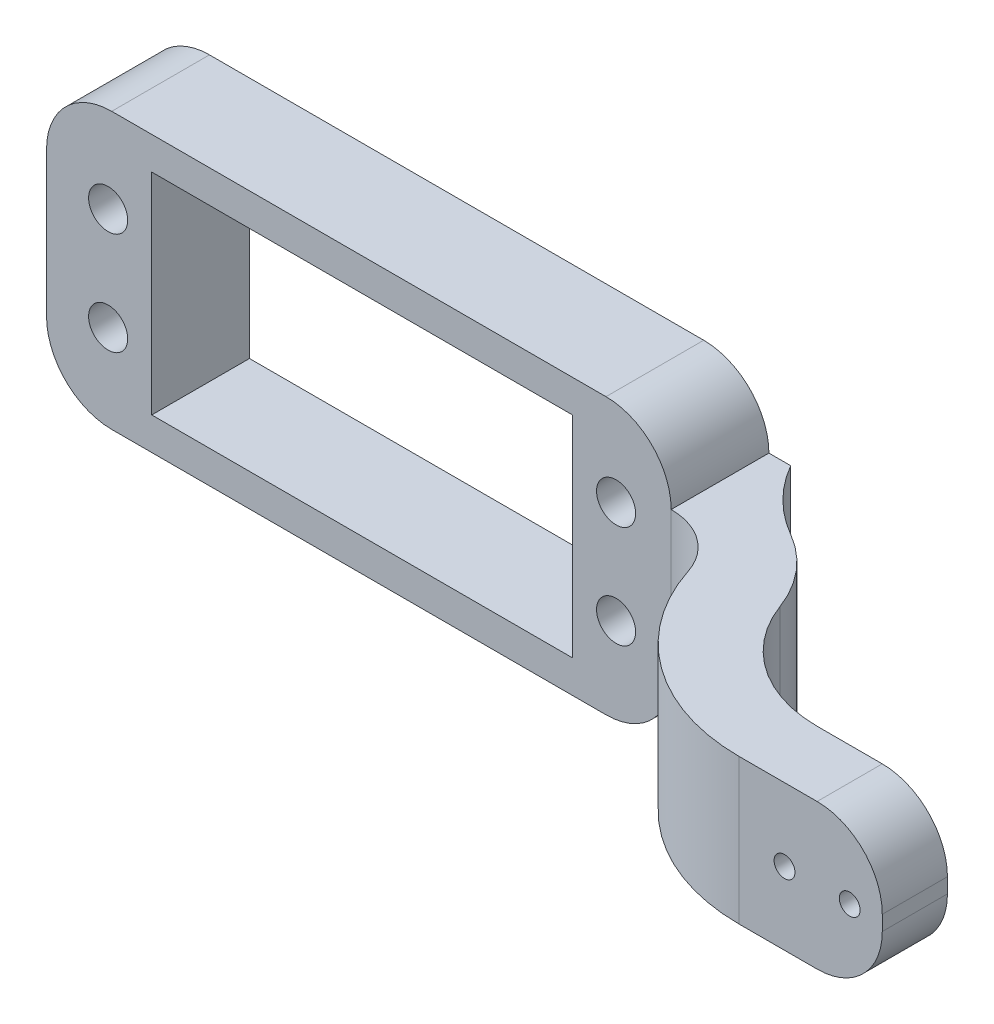
ISO-10303-21;
HEADER;
FILE_DESCRIPTION(('STEP AP214'),'2;1');
FILE_NAME('part.step','',(''),(''),'','','');
FILE_SCHEMA(('AUTOMOTIVE_DESIGN { 1 0 10303 214 1 1 1 1 }'));
ENDSEC;
DATA;
#1=APPLICATION_CONTEXT('core data for automotive mechanical design processes');
#2=APPLICATION_PROTOCOL_DEFINITION('international standard','automotive_design',2000,#1);
#3=PRODUCT_CONTEXT('',#1,'mechanical');
#4=PRODUCT('Part','Part','',(#3));
#5=PRODUCT_RELATED_PRODUCT_CATEGORY('part','',(#4));
#6=PRODUCT_DEFINITION_FORMATION('','',#4);
#7=PRODUCT_DEFINITION_CONTEXT('part definition',#1,'design');
#8=PRODUCT_DEFINITION('design','',#6,#7);
#9=PRODUCT_DEFINITION_SHAPE('','',#8);
#10=(LENGTH_UNIT() NAMED_UNIT(*) SI_UNIT(.MILLI.,.METRE.));
#11=(NAMED_UNIT(*) PLANE_ANGLE_UNIT() SI_UNIT($,.RADIAN.));
#12=(NAMED_UNIT(*) SI_UNIT($,.STERADIAN.) SOLID_ANGLE_UNIT());
#13=UNCERTAINTY_MEASURE_WITH_UNIT(LENGTH_MEASURE(1.E-05),#10,'distance_accuracy_value','');
#14=(GEOMETRIC_REPRESENTATION_CONTEXT(3) GLOBAL_UNCERTAINTY_ASSIGNED_CONTEXT((#13)) GLOBAL_UNIT_ASSIGNED_CONTEXT((#10,
#11,#12)) REPRESENTATION_CONTEXT('',''));
#15=CARTESIAN_POINT('',(0.,0.,0.));
#16=DIRECTION('',(0.,0.,1.));
#17=DIRECTION('',(1.,0.,0.));
#18=AXIS2_PLACEMENT_3D('',#15,#16,#17);
#19=CARTESIAN_POINT('',(0.,-7.07500000000002,13.589));
#20=DIRECTION('',(0.,-1.,0.));
#21=DIRECTION('',(0.,0.,-1.));
#22=AXIS2_PLACEMENT_3D('',#19,#20,#21);
#23=PLANE('',#22);
#24=DIRECTION('',(0.,0.,-1.));
#25=VECTOR('',#24,1.);
#26=CARTESIAN_POINT('',(30.1158833742651,-7.07500000000002,15.1765));
#27=LINE('',#26,#25);
#28=CARTESIAN_POINT('',(30.1158833742651,-7.07500000000003,15.1765));
#29=VERTEX_POINT('',#28);
#30=CARTESIAN_POINT('',(30.1158833742651,-7.07500000000002,5.6515));
#31=VERTEX_POINT('',#30);
#32=EDGE_CURVE('E292',#29,#31,#27,.T.);
#33=ORIENTED_EDGE('',*,*,#32,.T.);
#34=DIRECTION('',(1.,0.,0.));
#35=VECTOR('',#34,1.);
#36=CARTESIAN_POINT('',(0.,-7.07500000000002,5.6515));
#37=LINE('',#36,#35);
#38=CARTESIAN_POINT('',(32.2427300891871,-7.07500000000002,5.6515));
#39=VERTEX_POINT('',#38);
#40=EDGE_CURVE('E94',#31,#39,#37,.T.);
#41=ORIENTED_EDGE('',*,*,#40,.T.);
#42=CARTESIAN_POINT('',(45.9908833742651,-7.07500000000002,-2.286));
#43=DIRECTION('',(0.,-1.,0.));
#44=DIRECTION('',(0.,0.,-1.));
#45=AXIS2_PLACEMENT_3D('',#42,#43,#44);
#46=CIRCLE('',#45,15.875);
#47=CARTESIAN_POINT('',(38.0453631807094,-7.07500000000003,11.4575197039841));
#48=VERTEX_POINT('',#47);
#49=EDGE_CURVE('E342',#39,#48,#46,.F.);
#50=ORIENTED_EDGE('',*,*,#49,.T.);
#51=CARTESIAN_POINT('',(31.6889470258649,-7.07500000000002,22.4523354671714));
#52=DIRECTION('',(0.,-1.,0.));
#53=DIRECTION('',(0.,0.,-1.));
#54=AXIS2_PLACEMENT_3D('',#51,#52,#53);
#55=CIRCLE('',#54,12.7);
#56=CARTESIAN_POINT('',(43.602415200065,-7.07500000000003,18.0524177335857));
#57=VERTEX_POINT('',#56);
#58=EDGE_CURVE('E381',#57,#48,#55,.F.);
#59=ORIENTED_EDGE('',*,*,#58,.F.);
#60=CARTESIAN_POINT('',(55.5158833742651,-7.07500000000002,13.6525));
#61=DIRECTION('',(0.,-1.,0.));
#62=DIRECTION('',(0.,0.,-1.));
#63=AXIS2_PLACEMENT_3D('',#60,#61,#62);
#64=CIRCLE('',#63,12.7);
#65=CARTESIAN_POINT('',(55.5158833742651,-7.07500000000003,26.3525));
#66=VERTEX_POINT('',#65);
#67=EDGE_CURVE('E453',#66,#57,#64,.T.);
#68=ORIENTED_EDGE('',*,*,#67,.F.);
#69=DIRECTION('',(-1.,0.,0.));
#70=VECTOR('',#69,1.);
#71=CARTESIAN_POINT('',(0.,-7.07500000000002,26.3525));
#72=LINE('',#71,#70);
#73=CARTESIAN_POINT('',(61.8658833742651,-7.07500000000002,26.3525));
#74=VERTEX_POINT('',#73);
#75=EDGE_CURVE('E432',#74,#66,#72,.T.);
#76=ORIENTED_EDGE('',*,*,#75,.F.);
#77=DIRECTION('',(0.,0.,1.));
#78=VECTOR('',#77,1.);
#79=CARTESIAN_POINT('',(61.8658833742651,-7.07500000000002,32.7025));
#80=LINE('',#79,#78);
#81=CARTESIAN_POINT('',(61.8658833742651,-7.07500000000002,32.7025));
#82=VERTEX_POINT('',#81);
#83=EDGE_CURVE('E345',#74,#82,#80,.T.);
#84=ORIENTED_EDGE('',*,*,#83,.T.);
#85=DIRECTION('',(1.,0.,0.));
#86=VECTOR('',#85,1.);
#87=CARTESIAN_POINT('',(0.,-7.07500000000002,32.7025));
#88=LINE('',#87,#86);
#89=CARTESIAN_POINT('',(54.264591911162,-7.07500000000003,32.7025));
#90=VERTEX_POINT('',#89);
#91=EDGE_CURVE('E335',#90,#82,#88,.T.);
#92=ORIENTED_EDGE('',*,*,#91,.F.);
#93=CARTESIAN_POINT('',(54.264591911162,-7.07500000000002,13.6525));
#94=DIRECTION('',(0.,-1.,0.));
#95=DIRECTION('',(0.,0.,-1.));
#96=AXIS2_PLACEMENT_3D('',#93,#94,#95);
#97=CIRCLE('',#96,19.05);
#98=CARTESIAN_POINT('',(36.1530605084893,-7.07500000000003,19.558));
#99=VERTEX_POINT('',#98);
#100=EDGE_CURVE('E449',#90,#99,#97,.T.);
#101=ORIENTED_EDGE('',*,*,#100,.T.);
#102=CARTESIAN_POINT('',(30.1158833742651,-7.07500000000002,21.5265));
#103=DIRECTION('',(0.,-1.,0.));
#104=DIRECTION('',(0.,0.,-1.));
#105=AXIS2_PLACEMENT_3D('',#102,#103,#104);
#106=CIRCLE('',#105,6.35);
#107=EDGE_CURVE('E445',#99,#29,#106,.F.);
#108=ORIENTED_EDGE('',*,*,#107,.T.);
#109=EDGE_LOOP('',(#33,#41,#50,#59,#68,#76,#84,#92,#101,#108));
#110=FACE_BOUND('',#109,.T.);
#111=ADVANCED_FACE('F77',(#110),#23,.T.);
#112=CARTESIAN_POINT('',(0.,7.075,13.589));
#113=DIRECTION('',(0.,-1.,0.));
#114=DIRECTION('',(0.,0.,-1.));
#115=AXIS2_PLACEMENT_3D('',#112,#113,#114);
#116=PLANE('',#115);
#117=DIRECTION('',(1.,0.,0.));
#118=VECTOR('',#117,1.);
#119=CARTESIAN_POINT('',(0.,7.075,5.6515));
#120=LINE('',#119,#118);
#121=CARTESIAN_POINT('',(30.1158833742651,7.075,5.6515));
#122=VERTEX_POINT('',#121);
#123=CARTESIAN_POINT('',(32.2427300891871,7.075,5.6515));
#124=VERTEX_POINT('',#123);
#125=EDGE_CURVE('E399',#122,#124,#120,.T.);
#126=ORIENTED_EDGE('',*,*,#125,.F.);
#127=DIRECTION('',(0.,0.,-1.));
#128=VECTOR('',#127,1.);
#129=CARTESIAN_POINT('',(30.1158833742651,7.075,15.1765));
#130=LINE('',#129,#128);
#131=CARTESIAN_POINT('',(30.1158833742651,7.075,15.1765));
#132=VERTEX_POINT('',#131);
#133=EDGE_CURVE('E288',#132,#122,#130,.T.);
#134=ORIENTED_EDGE('',*,*,#133,.F.);
#135=CARTESIAN_POINT('',(30.1158833742651,7.075,21.5265));
#136=DIRECTION('',(0.,1.,0.));
#137=DIRECTION('',(0.,0.,1.));
#138=AXIS2_PLACEMENT_3D('',#135,#136,#137);
#139=CIRCLE('',#138,6.35);
#140=CARTESIAN_POINT('',(36.1530605084893,7.075,19.558));
#141=VERTEX_POINT('',#140);
#142=EDGE_CURVE('E422',#132,#141,#139,.F.);
#143=ORIENTED_EDGE('',*,*,#142,.T.);
#144=CARTESIAN_POINT('',(54.264591911162,7.075,13.6525));
#145=DIRECTION('',(0.,1.,0.));
#146=DIRECTION('',(0.,0.,1.));
#147=AXIS2_PLACEMENT_3D('',#144,#145,#146);
#148=CIRCLE('',#147,19.05);
#149=CARTESIAN_POINT('',(54.264591911162,7.075,32.7025));
#150=VERTEX_POINT('',#149);
#151=EDGE_CURVE('E413',#141,#150,#148,.T.);
#152=ORIENTED_EDGE('',*,*,#151,.T.);
#153=DIRECTION('',(1.,0.,0.));
#154=VECTOR('',#153,1.);
#155=CARTESIAN_POINT('',(0.,7.075,32.7025));
#156=LINE('',#155,#154);
#157=CARTESIAN_POINT('',(61.8658833742651,7.075,32.7025));
#158=VERTEX_POINT('',#157);
#159=EDGE_CURVE('E332',#150,#158,#156,.T.);
#160=ORIENTED_EDGE('',*,*,#159,.T.);
#161=DIRECTION('',(0.,0.,1.));
#162=VECTOR('',#161,1.);
#163=CARTESIAN_POINT('',(61.8658833742651,7.075,13.589));
#164=LINE('',#163,#162);
#165=CARTESIAN_POINT('',(61.8658833742651,7.075,26.3525));
#166=VERTEX_POINT('',#165);
#167=EDGE_CURVE('E363',#158,#166,#164,.F.);
#168=ORIENTED_EDGE('',*,*,#167,.T.);
#169=DIRECTION('',(1.,0.,0.));
#170=VECTOR('',#169,1.);
#171=CARTESIAN_POINT('',(0.,7.075,26.3525));
#172=LINE('',#171,#170);
#173=CARTESIAN_POINT('',(55.5158833742651,7.075,26.3525));
#174=VERTEX_POINT('',#173);
#175=EDGE_CURVE('E405',#174,#166,#172,.T.);
#176=ORIENTED_EDGE('',*,*,#175,.F.);
#177=CARTESIAN_POINT('',(55.5158833742651,7.075,13.6525));
#178=DIRECTION('',(0.,1.,0.));
#179=DIRECTION('',(0.,0.,1.));
#180=AXIS2_PLACEMENT_3D('',#177,#178,#179);
#181=CIRCLE('',#180,12.7);
#182=CARTESIAN_POINT('',(43.602415200065,7.075,18.0524177335857));
#183=VERTEX_POINT('',#182);
#184=EDGE_CURVE('E390',#183,#174,#181,.T.);
#185=ORIENTED_EDGE('',*,*,#184,.F.);
#186=CARTESIAN_POINT('',(31.6889470258649,7.075,22.4523354671714));
#187=DIRECTION('',(0.,1.,0.));
#188=DIRECTION('',(0.,0.,1.));
#189=AXIS2_PLACEMENT_3D('',#186,#187,#188);
#190=CIRCLE('',#189,12.7);
#191=CARTESIAN_POINT('',(38.0453631807094,7.075,11.4575197039841));
#192=VERTEX_POINT('',#191);
#193=EDGE_CURVE('E378',#192,#183,#190,.F.);
#194=ORIENTED_EDGE('',*,*,#193,.F.);
#195=CARTESIAN_POINT('',(45.9908833742651,7.075,-2.286));
#196=DIRECTION('',(0.,-1.,0.));
#197=DIRECTION('',(0.,0.,-1.));
#198=AXIS2_PLACEMENT_3D('',#195,#196,#197);
#199=CIRCLE('',#198,15.875);
#200=EDGE_CURVE('E338',#192,#124,#199,.T.);
#201=ORIENTED_EDGE('',*,*,#200,.T.);
#202=EDGE_LOOP('',(#126,#134,#143,#152,#160,#168,#176,#185,#194,#201));
#203=FACE_BOUND('',#202,.T.);
#204=ADVANCED_FACE('F387',(#203),#116,.F.);
#205=CARTESIAN_POINT('',(45.9908833742651,0.,-2.286));
#206=DIRECTION('',(0.,-1.,0.));
#207=DIRECTION('',(0.,0.,-1.));
#208=AXIS2_PLACEMENT_3D('',#205,#206,#207);
#209=CYLINDRICAL_SURFACE('',#208,15.875);
#210=DIRECTION('',(0.,-1.,0.));
#211=VECTOR('',#210,1.);
#212=CARTESIAN_POINT('',(32.2427300891871,0.,5.6515));
#213=LINE('',#212,#211);
#214=EDGE_CURVE('E392',#124,#39,#213,.T.);
#215=ORIENTED_EDGE('',*,*,#214,.F.);
#216=ORIENTED_EDGE('',*,*,#200,.F.);
#217=DIRECTION('',(0.,1.,0.));
#218=VECTOR('',#217,1.);
#219=CARTESIAN_POINT('',(38.0453631807094,-3.17500000000002,11.4575197039841));
#220=LINE('',#219,#218);
#221=EDGE_CURVE('E87',#48,#192,#220,.T.);
#222=ORIENTED_EDGE('',*,*,#221,.F.);
#223=ORIENTED_EDGE('',*,*,#49,.F.);
#224=EDGE_LOOP('',(#215,#216,#222,#223));
#225=FACE_BOUND('',#224,.T.);
#226=ADVANCED_FACE('F395',(#225),#209,.F.);
#227=CARTESIAN_POINT('',(23.7658833742651,7.075,15.1765));
#228=DIRECTION('',(0.,0.,-1.));
#229=DIRECTION('',(-1.,0.,0.));
#230=AXIS2_PLACEMENT_3D('',#227,#228,#229);
#231=CYLINDRICAL_SURFACE('',#230,6.35);
#232=CARTESIAN_POINT('',(23.7658833742651,7.075,5.6515));
#233=DIRECTION('',(0.,0.,-1.));
#234=DIRECTION('',(-1.,0.,0.));
#235=AXIS2_PLACEMENT_3D('',#232,#233,#234);
#236=CIRCLE('',#235,6.35);
#237=CARTESIAN_POINT('',(23.7658833742651,13.425,5.6515));
#238=VERTEX_POINT('',#237);
#239=EDGE_CURVE('E519',#238,#122,#236,.T.);
#240=ORIENTED_EDGE('',*,*,#239,.F.);
#241=DIRECTION('',(0.,0.,-1.));
#242=VECTOR('',#241,1.);
#243=CARTESIAN_POINT('',(23.7658833742651,13.425,15.1765));
#244=LINE('',#243,#242);
#245=CARTESIAN_POINT('',(23.7658833742651,13.425,15.1765));
#246=VERTEX_POINT('',#245);
#247=EDGE_CURVE('E316',#246,#238,#244,.T.);
#248=ORIENTED_EDGE('',*,*,#247,.F.);
#249=CARTESIAN_POINT('',(23.7658833742651,7.075,15.1765));
#250=DIRECTION('',(0.,0.,1.));
#251=DIRECTION('',(-1.,0.,0.));
#252=AXIS2_PLACEMENT_3D('',#249,#250,#251);
#253=CIRCLE('',#252,6.35);
#254=EDGE_CURVE('E253',#132,#246,#253,.T.);
#255=ORIENTED_EDGE('',*,*,#254,.F.);
#256=ORIENTED_EDGE('',*,*,#133,.T.);
#257=EDGE_LOOP('',(#240,#248,#255,#256));
#258=FACE_BOUND('',#257,.T.);
#259=ADVANCED_FACE('F526',(#258),#231,.T.);
#260=CARTESIAN_POINT('',(23.7658833742651,13.425,15.1765));
#261=DIRECTION('',(0.,-1.,0.));
#262=DIRECTION('',(1.,0.,0.));
#263=AXIS2_PLACEMENT_3D('',#260,#261,#262);
#264=PLANE('',#263);
#265=DIRECTION('',(1.,0.,0.));
#266=VECTOR('',#265,1.);
#267=CARTESIAN_POINT('',(23.7658833742651,13.425,5.6515));
#268=LINE('',#267,#266);
#269=CARTESIAN_POINT('',(-24.4,13.425,5.6515));
#270=VERTEX_POINT('',#269);
#271=EDGE_CURVE('E516',#270,#238,#268,.T.);
#272=ORIENTED_EDGE('',*,*,#271,.F.);
#273=DIRECTION('',(0.,0.,-1.));
#274=VECTOR('',#273,1.);
#275=CARTESIAN_POINT('',(-24.4,13.425,15.1765));
#276=LINE('',#275,#274);
#277=CARTESIAN_POINT('',(-24.4,13.425,15.1765));
#278=VERTEX_POINT('',#277);
#279=EDGE_CURVE('E312',#278,#270,#276,.T.);
#280=ORIENTED_EDGE('',*,*,#279,.F.);
#281=DIRECTION('',(-1.,0.,0.));
#282=VECTOR('',#281,1.);
#283=CARTESIAN_POINT('',(23.7658833742651,13.425,15.1765));
#284=LINE('',#283,#282);
#285=EDGE_CURVE('E259',#246,#278,#284,.T.);
#286=ORIENTED_EDGE('',*,*,#285,.F.);
#287=ORIENTED_EDGE('',*,*,#247,.T.);
#288=EDGE_LOOP('',(#272,#280,#286,#287));
#289=FACE_BOUND('',#288,.T.);
#290=ADVANCED_FACE('F627',(#289),#264,.F.);
#291=CARTESIAN_POINT('',(-24.4,7.07500000000003,15.1765));
#292=DIRECTION('',(0.,0.,-1.));
#293=DIRECTION('',(-1.,0.,0.));
#294=AXIS2_PLACEMENT_3D('',#291,#292,#293);
#295=CYLINDRICAL_SURFACE('',#294,6.35);
#296=CARTESIAN_POINT('',(-24.4,7.07500000000003,5.6515));
#297=DIRECTION('',(0.,0.,-1.));
#298=DIRECTION('',(-1.,0.,0.));
#299=AXIS2_PLACEMENT_3D('',#296,#297,#298);
#300=CIRCLE('',#299,6.35);
#301=CARTESIAN_POINT('',(-30.75,7.07500000000003,5.6515));
#302=VERTEX_POINT('',#301);
#303=EDGE_CURVE('E513',#302,#270,#300,.T.);
#304=ORIENTED_EDGE('',*,*,#303,.F.);
#305=DIRECTION('',(0.,0.,-1.));
#306=VECTOR('',#305,1.);
#307=CARTESIAN_POINT('',(-30.75,7.07500000000003,15.1765));
#308=LINE('',#307,#306);
#309=CARTESIAN_POINT('',(-30.75,7.07500000000003,15.1765));
#310=VERTEX_POINT('',#309);
#311=EDGE_CURVE('E308',#310,#302,#308,.T.);
#312=ORIENTED_EDGE('',*,*,#311,.F.);
#313=CARTESIAN_POINT('',(-24.4,7.07500000000003,15.1765));
#314=DIRECTION('',(0.,0.,1.));
#315=DIRECTION('',(1.,0.,0.));
#316=AXIS2_PLACEMENT_3D('',#313,#314,#315);
#317=CIRCLE('',#316,6.35);
#318=EDGE_CURVE('E268',#278,#310,#317,.T.);
#319=ORIENTED_EDGE('',*,*,#318,.F.);
#320=ORIENTED_EDGE('',*,*,#279,.T.);
#321=EDGE_LOOP('',(#304,#312,#319,#320));
#322=FACE_BOUND('',#321,.T.);
#323=ADVANCED_FACE('F623',(#322),#295,.T.);
#324=CARTESIAN_POINT('',(-30.75,7.07500000000003,15.1765));
#325=DIRECTION('',(1.,0.,0.));
#326=DIRECTION('',(0.,1.,0.));
#327=AXIS2_PLACEMENT_3D('',#324,#325,#326);
#328=PLANE('',#327);
#329=DIRECTION('',(0.,1.,0.));
#330=VECTOR('',#329,1.);
#331=CARTESIAN_POINT('',(-30.75,7.07500000000003,5.6515));
#332=LINE('',#331,#330);
#333=CARTESIAN_POINT('',(-30.75,-7.07500000000001,5.6515));
#334=VERTEX_POINT('',#333);
#335=EDGE_CURVE('E510',#334,#302,#332,.T.);
#336=ORIENTED_EDGE('',*,*,#335,.F.);
#337=DIRECTION('',(0.,0.,-1.));
#338=VECTOR('',#337,1.);
#339=CARTESIAN_POINT('',(-30.75,-7.07500000000001,15.1765));
#340=LINE('',#339,#338);
#341=CARTESIAN_POINT('',(-30.75,-7.07500000000001,15.1765));
#342=VERTEX_POINT('',#341);
#343=EDGE_CURVE('E304',#342,#334,#340,.T.);
#344=ORIENTED_EDGE('',*,*,#343,.F.);
#345=DIRECTION('',(0.,-1.,0.));
#346=VECTOR('',#345,1.);
#347=CARTESIAN_POINT('',(-30.75,7.07500000000003,15.1765));
#348=LINE('',#347,#346);
#349=EDGE_CURVE('E271',#310,#342,#348,.T.);
#350=ORIENTED_EDGE('',*,*,#349,.F.);
#351=ORIENTED_EDGE('',*,*,#311,.T.);
#352=EDGE_LOOP('',(#336,#344,#350,#351));
#353=FACE_BOUND('',#352,.T.);
#354=ADVANCED_FACE('F619',(#353),#328,.F.);
#355=CARTESIAN_POINT('',(-24.4,-7.07500000000001,15.1765));
#356=DIRECTION('',(0.,0.,-1.));
#357=DIRECTION('',(-1.,0.,0.));
#358=AXIS2_PLACEMENT_3D('',#355,#356,#357);
#359=CYLINDRICAL_SURFACE('',#358,6.35);
#360=CARTESIAN_POINT('',(-24.4,-7.07500000000001,5.6515));
#361=DIRECTION('',(0.,0.,-1.));
#362=DIRECTION('',(-1.,0.,0.));
#363=AXIS2_PLACEMENT_3D('',#360,#361,#362);
#364=CIRCLE('',#363,6.35);
#365=CARTESIAN_POINT('',(-24.4,-13.425,5.6515));
#366=VERTEX_POINT('',#365);
#367=EDGE_CURVE('E507',#366,#334,#364,.T.);
#368=ORIENTED_EDGE('',*,*,#367,.F.);
#369=DIRECTION('',(0.,0.,-1.));
#370=VECTOR('',#369,1.);
#371=CARTESIAN_POINT('',(-24.4,-13.425,15.1765));
#372=LINE('',#371,#370);
#373=CARTESIAN_POINT('',(-24.4,-13.425,15.1765));
#374=VERTEX_POINT('',#373);
#375=EDGE_CURVE('E300',#374,#366,#372,.T.);
#376=ORIENTED_EDGE('',*,*,#375,.F.);
#377=CARTESIAN_POINT('',(-24.4,-7.07500000000001,15.1765));
#378=DIRECTION('',(0.,0.,1.));
#379=DIRECTION('',(1.,0.,0.));
#380=AXIS2_PLACEMENT_3D('',#377,#378,#379);
#381=CIRCLE('',#380,6.35);
#382=EDGE_CURVE('E274',#342,#374,#381,.T.);
#383=ORIENTED_EDGE('',*,*,#382,.F.);
#384=ORIENTED_EDGE('',*,*,#343,.T.);
#385=EDGE_LOOP('',(#368,#376,#383,#384));
#386=FACE_BOUND('',#385,.T.);
#387=ADVANCED_FACE('F615',(#386),#359,.T.);
#388=CARTESIAN_POINT('',(23.7658833742651,-13.425,15.1765));
#389=DIRECTION('',(0.,1.,0.));
#390=DIRECTION('',(-1.,0.,0.));
#391=AXIS2_PLACEMENT_3D('',#388,#389,#390);
#392=PLANE('',#391);
#393=DIRECTION('',(-1.,0.,0.));
#394=VECTOR('',#393,1.);
#395=CARTESIAN_POINT('',(23.7658833742651,-13.425,5.6515));
#396=LINE('',#395,#394);
#397=CARTESIAN_POINT('',(23.7658833742651,-13.425,5.6515));
#398=VERTEX_POINT('',#397);
#399=EDGE_CURVE('E504',#398,#366,#396,.T.);
#400=ORIENTED_EDGE('',*,*,#399,.F.);
#401=DIRECTION('',(0.,0.,-1.));
#402=VECTOR('',#401,1.);
#403=CARTESIAN_POINT('',(23.7658833742651,-13.425,15.1765));
#404=LINE('',#403,#402);
#405=CARTESIAN_POINT('',(23.7658833742651,-13.425,15.1765));
#406=VERTEX_POINT('',#405);
#407=EDGE_CURVE('E296',#406,#398,#404,.T.);
#408=ORIENTED_EDGE('',*,*,#407,.F.);
#409=DIRECTION('',(1.,0.,0.));
#410=VECTOR('',#409,1.);
#411=CARTESIAN_POINT('',(23.7658833742651,-13.425,15.1765));
#412=LINE('',#411,#410);
#413=EDGE_CURVE('E277',#374,#406,#412,.T.);
#414=ORIENTED_EDGE('',*,*,#413,.F.);
#415=ORIENTED_EDGE('',*,*,#375,.T.);
#416=EDGE_LOOP('',(#400,#408,#414,#415));
#417=FACE_BOUND('',#416,.T.);
#418=ADVANCED_FACE('F611',(#417),#392,.F.);
#419=CARTESIAN_POINT('',(23.7658833742651,-7.07500000000002,15.1765));
#420=DIRECTION('',(0.,0.,-1.));
#421=DIRECTION('',(-1.,0.,0.));
#422=AXIS2_PLACEMENT_3D('',#419,#420,#421);
#423=CYLINDRICAL_SURFACE('',#422,6.35);
#424=CARTESIAN_POINT('',(23.7658833742651,-7.07500000000002,5.6515));
#425=DIRECTION('',(0.,0.,-1.));
#426=DIRECTION('',(-1.,0.,0.));
#427=AXIS2_PLACEMENT_3D('',#424,#425,#426);
#428=CIRCLE('',#427,6.35);
#429=EDGE_CURVE('E245',#31,#398,#428,.T.);
#430=ORIENTED_EDGE('',*,*,#429,.F.);
#431=ORIENTED_EDGE('',*,*,#32,.F.);
#432=CARTESIAN_POINT('',(23.7658833742651,-7.07500000000002,15.1765));
#433=DIRECTION('',(0.,0.,1.));
#434=DIRECTION('',(1.,0.,0.));
#435=AXIS2_PLACEMENT_3D('',#432,#433,#434);
#436=CIRCLE('',#435,6.35);
#437=EDGE_CURVE('E280',#406,#29,#436,.T.);
#438=ORIENTED_EDGE('',*,*,#437,.F.);
#439=ORIENTED_EDGE('',*,*,#407,.T.);
#440=EDGE_LOOP('',(#430,#431,#438,#439));
#441=FACE_BOUND('',#440,.T.);
#442=ADVANCED_FACE('F608',(#441),#423,.T.);
#443=CARTESIAN_POINT('',(-20.5,10.25,-61.0158935387457));
#444=DIRECTION('',(-1.,0.,0.));
#445=DIRECTION('',(0.,-1.,0.));
#446=AXIS2_PLACEMENT_3D('',#443,#444,#445);
#447=PLANE('',#446);
#448=DIRECTION('',(0.,-1.,0.));
#449=VECTOR('',#448,1.);
#450=CARTESIAN_POINT('',(-20.5,10.25,5.6515));
#451=LINE('',#450,#449);
#452=CARTESIAN_POINT('',(-20.5,10.25,5.6515));
#453=VERTEX_POINT('',#452);
#454=CARTESIAN_POINT('',(-20.5,-10.25,5.6515));
#455=VERTEX_POINT('',#454);
#456=EDGE_CURVE('E229',#453,#455,#451,.T.);
#457=ORIENTED_EDGE('',*,*,#456,.F.);
#458=DIRECTION('',(0.,0.,1.));
#459=VECTOR('',#458,1.);
#460=CARTESIAN_POINT('',(-20.5,10.25,-61.0158935387457));
#461=LINE('',#460,#459);
#462=CARTESIAN_POINT('',(-20.5,10.25,15.1765));
#463=VERTEX_POINT('',#462);
#464=EDGE_CURVE('E241',#453,#463,#461,.T.);
#465=ORIENTED_EDGE('',*,*,#464,.T.);
#466=DIRECTION('',(0.,-1.,0.));
#467=VECTOR('',#466,1.);
#468=CARTESIAN_POINT('',(-20.5,10.25,15.1765));
#469=LINE('',#468,#467);
#470=CARTESIAN_POINT('',(-20.5,-10.25,15.1765));
#471=VERTEX_POINT('',#470);
#472=EDGE_CURVE('E480',#463,#471,#469,.T.);
#473=ORIENTED_EDGE('',*,*,#472,.T.);
#474=DIRECTION('',(0.,0.,1.));
#475=VECTOR('',#474,1.);
#476=CARTESIAN_POINT('',(-20.5,-10.25,-61.0158935387457));
#477=LINE('',#476,#475);
#478=EDGE_CURVE('E243',#455,#471,#477,.T.);
#479=ORIENTED_EDGE('',*,*,#478,.F.);
#480=EDGE_LOOP('',(#457,#465,#473,#479));
#481=FACE_BOUND('',#480,.T.);
#482=ADVANCED_FACE('F239',(#481),#447,.F.);
#483=CARTESIAN_POINT('',(-20.5,-10.25,-61.0158935387457));
#484=DIRECTION('',(0.,-1.,0.));
#485=DIRECTION('',(1.,0.,0.));
#486=AXIS2_PLACEMENT_3D('',#483,#484,#485);
#487=PLANE('',#486);
#488=DIRECTION('',(1.,0.,0.));
#489=VECTOR('',#488,1.);
#490=CARTESIAN_POINT('',(-20.5,-10.25,5.6515));
#491=LINE('',#490,#489);
#492=CARTESIAN_POINT('',(20.5,-10.25,5.6515));
#493=VERTEX_POINT('',#492);
#494=EDGE_CURVE('E246',#455,#493,#491,.T.);
#495=ORIENTED_EDGE('',*,*,#494,.F.);
#496=ORIENTED_EDGE('',*,*,#478,.T.);
#497=DIRECTION('',(1.,0.,0.));
#498=VECTOR('',#497,1.);
#499=CARTESIAN_POINT('',(-20.5,-10.25,15.1765));
#500=LINE('',#499,#498);
#501=CARTESIAN_POINT('',(20.5,-10.25,15.1765));
#502=VERTEX_POINT('',#501);
#503=EDGE_CURVE('E476',#471,#502,#500,.T.);
#504=ORIENTED_EDGE('',*,*,#503,.T.);
#505=DIRECTION('',(0.,0.,1.));
#506=VECTOR('',#505,1.);
#507=CARTESIAN_POINT('',(20.5,-10.25,-61.0158935387457));
#508=LINE('',#507,#506);
#509=EDGE_CURVE('E261',#493,#502,#508,.T.);
#510=ORIENTED_EDGE('',*,*,#509,.F.);
#511=EDGE_LOOP('',(#495,#496,#504,#510));
#512=FACE_BOUND('',#511,.T.);
#513=ADVANCED_FACE('F489',(#512),#487,.F.);
#514=CARTESIAN_POINT('',(20.5,-10.25,-61.0158935387457));
#515=DIRECTION('',(1.,0.,0.));
#516=DIRECTION('',(0.,0.,-1.));
#517=AXIS2_PLACEMENT_3D('',#514,#515,#516);
#518=PLANE('',#517);
#519=DIRECTION('',(0.,1.,0.));
#520=VECTOR('',#519,1.);
#521=CARTESIAN_POINT('',(20.5,-10.25,5.6515));
#522=LINE('',#521,#520);
#523=CARTESIAN_POINT('',(20.5,10.25,5.6515));
#524=VERTEX_POINT('',#523);
#525=EDGE_CURVE('E102',#493,#524,#522,.T.);
#526=ORIENTED_EDGE('',*,*,#525,.F.);
#527=ORIENTED_EDGE('',*,*,#509,.T.);
#528=DIRECTION('',(0.,1.,0.));
#529=VECTOR('',#528,1.);
#530=CARTESIAN_POINT('',(20.5,-10.25,15.1765));
#531=LINE('',#530,#529);
#532=CARTESIAN_POINT('',(20.5,10.25,15.1765));
#533=VERTEX_POINT('',#532);
#534=EDGE_CURVE('E472',#502,#533,#531,.T.);
#535=ORIENTED_EDGE('',*,*,#534,.T.);
#536=DIRECTION('',(0.,0.,1.));
#537=VECTOR('',#536,1.);
#538=CARTESIAN_POINT('',(20.5,10.25,-61.0158935387457));
#539=LINE('',#538,#537);
#540=EDGE_CURVE('E254',#524,#533,#539,.T.);
#541=ORIENTED_EDGE('',*,*,#540,.F.);
#542=EDGE_LOOP('',(#526,#527,#535,#541));
#543=FACE_BOUND('',#542,.T.);
#544=ADVANCED_FACE('F495',(#543),#518,.F.);
#545=CARTESIAN_POINT('',(20.5,10.25,-61.0158935387457));
#546=DIRECTION('',(0.,1.,0.));
#547=DIRECTION('',(-1.,0.,0.));
#548=AXIS2_PLACEMENT_3D('',#545,#546,#547);
#549=PLANE('',#548);
#550=DIRECTION('',(-1.,0.,0.));
#551=VECTOR('',#550,1.);
#552=CARTESIAN_POINT('',(20.5,10.25,5.6515));
#553=LINE('',#552,#551);
#554=EDGE_CURVE('E225',#524,#453,#553,.T.);
#555=ORIENTED_EDGE('',*,*,#554,.F.);
#556=ORIENTED_EDGE('',*,*,#540,.T.);
#557=DIRECTION('',(-1.,0.,0.));
#558=VECTOR('',#557,1.);
#559=CARTESIAN_POINT('',(20.5,10.25,15.1765));
#560=LINE('',#559,#558);
#561=EDGE_CURVE('E250',#533,#463,#560,.T.);
#562=ORIENTED_EDGE('',*,*,#561,.T.);
#563=ORIENTED_EDGE('',*,*,#464,.F.);
#564=EDGE_LOOP('',(#555,#556,#562,#563));
#565=FACE_BOUND('',#564,.T.);
#566=ADVANCED_FACE('F248',(#565),#549,.F.);
#567=CARTESIAN_POINT('',(-24.75,5.,2.4765));
#568=DIRECTION('',(0.,0.,1.));
#569=DIRECTION('',(1.,0.,0.));
#570=AXIS2_PLACEMENT_3D('',#567,#568,#569);
#571=CYLINDRICAL_SURFACE('',#570,1.905);
#572=CARTESIAN_POINT('',(-24.75,5.,15.1765));
#573=DIRECTION('',(0.,0.,1.));
#574=DIRECTION('',(1.,0.,0.));
#575=AXIS2_PLACEMENT_3D('',#572,#573,#574);
#576=CIRCLE('',#575,1.905);
#577=CARTESIAN_POINT('',(-22.845,5.,15.1765));
#578=VERTEX_POINT('',#577);
#579=EDGE_CURVE('E461',#578,#578,#576,.T.);
#580=ORIENTED_EDGE('',*,*,#579,.T.);
#581=EDGE_LOOP('',(#580));
#582=FACE_BOUND('',#581,.T.);
#583=CARTESIAN_POINT('',(-24.75,5.,5.6515));
#584=DIRECTION('',(0.,0.,-1.));
#585=DIRECTION('',(-1.,0.,0.));
#586=AXIS2_PLACEMENT_3D('',#583,#584,#585);
#587=CIRCLE('',#586,1.905);
#588=CARTESIAN_POINT('',(-26.655,5.,5.6515));
#589=VERTEX_POINT('',#588);
#590=EDGE_CURVE('E235',#589,#589,#587,.F.);
#591=ORIENTED_EDGE('',*,*,#590,.F.);
#592=EDGE_LOOP('',(#591));
#593=FACE_BOUND('',#592,.T.);
#594=ADVANCED_FACE('F692',(#582,#593),#571,.F.);
#595=CARTESIAN_POINT('',(-24.75,-5.,2.4765));
#596=DIRECTION('',(0.,0.,1.));
#597=DIRECTION('',(1.,0.,0.));
#598=AXIS2_PLACEMENT_3D('',#595,#596,#597);
#599=CYLINDRICAL_SURFACE('',#598,1.905);
#600=CARTESIAN_POINT('',(-24.75,-5.,15.1765));
#601=DIRECTION('',(0.,0.,1.));
#602=DIRECTION('',(1.,0.,0.));
#603=AXIS2_PLACEMENT_3D('',#600,#601,#602);
#604=CIRCLE('',#603,1.905);
#605=CARTESIAN_POINT('',(-22.845,-5.,15.1765));
#606=VERTEX_POINT('',#605);
#607=EDGE_CURVE('E457',#606,#606,#604,.T.);
#608=ORIENTED_EDGE('',*,*,#607,.T.);
#609=EDGE_LOOP('',(#608));
#610=FACE_BOUND('',#609,.T.);
#611=CARTESIAN_POINT('',(-24.75,-5.,5.6515));
#612=DIRECTION('',(0.,0.,-1.));
#613=DIRECTION('',(-1.,0.,0.));
#614=AXIS2_PLACEMENT_3D('',#611,#612,#613);
#615=CIRCLE('',#614,1.905);
#616=CARTESIAN_POINT('',(-26.655,-5.,5.6515));
#617=VERTEX_POINT('',#616);
#618=EDGE_CURVE('E872',#617,#617,#615,.F.);
#619=ORIENTED_EDGE('',*,*,#618,.F.);
#620=EDGE_LOOP('',(#619));
#621=FACE_BOUND('',#620,.T.);
#622=ADVANCED_FACE('F700',(#610,#621),#599,.F.);
#623=CARTESIAN_POINT('',(24.75,-4.99999999999999,2.4765));
#624=DIRECTION('',(0.,0.,1.));
#625=DIRECTION('',(1.,0.,0.));
#626=AXIS2_PLACEMENT_3D('',#623,#624,#625);
#627=CYLINDRICAL_SURFACE('',#626,1.905);
#628=CARTESIAN_POINT('',(24.75,-4.99999999999999,15.1765));
#629=DIRECTION('',(0.,0.,1.));
#630=DIRECTION('',(1.,0.,0.));
#631=AXIS2_PLACEMENT_3D('',#628,#629,#630);
#632=CIRCLE('',#631,1.905);
#633=CARTESIAN_POINT('',(26.655,-4.99999999999999,15.1765));
#634=VERTEX_POINT('',#633);
#635=EDGE_CURVE('E462',#634,#634,#632,.T.);
#636=ORIENTED_EDGE('',*,*,#635,.T.);
#637=EDGE_LOOP('',(#636));
#638=FACE_BOUND('',#637,.T.);
#639=CARTESIAN_POINT('',(24.75,-4.99999999999999,5.6515));
#640=DIRECTION('',(0.,0.,-1.));
#641=DIRECTION('',(-1.,0.,0.));
#642=AXIS2_PLACEMENT_3D('',#639,#640,#641);
#643=CIRCLE('',#642,1.905);
#644=CARTESIAN_POINT('',(22.845,-4.99999999999999,5.6515));
#645=VERTEX_POINT('',#644);
#646=EDGE_CURVE('E869',#645,#645,#643,.F.);
#647=ORIENTED_EDGE('',*,*,#646,.F.);
#648=EDGE_LOOP('',(#647));
#649=FACE_BOUND('',#648,.T.);
#650=ADVANCED_FACE('F709',(#638,#649),#627,.F.);
#651=CARTESIAN_POINT('',(24.75,4.99999999999999,2.4765));
#652=DIRECTION('',(0.,0.,1.));
#653=DIRECTION('',(1.,0.,0.));
#654=AXIS2_PLACEMENT_3D('',#651,#652,#653);
#655=CYLINDRICAL_SURFACE('',#654,1.905);
#656=CARTESIAN_POINT('',(24.75,4.99999999999999,15.1765));
#657=DIRECTION('',(0.,0.,1.));
#658=DIRECTION('',(1.,0.,0.));
#659=AXIS2_PLACEMENT_3D('',#656,#657,#658);
#660=CIRCLE('',#659,1.905);
#661=CARTESIAN_POINT('',(26.655,4.99999999999999,15.1765));
#662=VERTEX_POINT('',#661);
#663=EDGE_CURVE('E456',#662,#662,#660,.T.);
#664=ORIENTED_EDGE('',*,*,#663,.T.);
#665=EDGE_LOOP('',(#664));
#666=FACE_BOUND('',#665,.T.);
#667=CARTESIAN_POINT('',(24.75,4.99999999999999,5.6515));
#668=DIRECTION('',(0.,0.,-1.));
#669=DIRECTION('',(-1.,0.,0.));
#670=AXIS2_PLACEMENT_3D('',#667,#668,#669);
#671=CIRCLE('',#670,1.905);
#672=CARTESIAN_POINT('',(22.845,4.99999999999999,5.6515));
#673=VERTEX_POINT('',#672);
#674=EDGE_CURVE('E81',#673,#673,#671,.F.);
#675=ORIENTED_EDGE('',*,*,#674,.F.);
#676=EDGE_LOOP('',(#675));
#677=FACE_BOUND('',#676,.T.);
#678=ADVANCED_FACE('F718',(#666,#677),#655,.F.);
#679=CARTESIAN_POINT('',(0.,0.,32.7025));
#680=DIRECTION('',(0.,0.,1.));
#681=DIRECTION('',(1.,0.,0.));
#682=AXIS2_PLACEMENT_3D('',#679,#680,#681);
#683=PLANE('',#682);
#684=CARTESIAN_POINT('',(65.0408833742651,0.,32.7025));
#685=DIRECTION('',(0.,0.,1.));
#686=DIRECTION('',(1.,0.,0.));
#687=AXIS2_PLACEMENT_3D('',#684,#685,#686);
#688=CIRCLE('',#687,1.016);
#689=CARTESIAN_POINT('',(66.0568833742651,0.,32.7025));
#690=VERTEX_POINT('',#689);
#691=EDGE_CURVE('E320',#690,#690,#688,.T.);
#692=ORIENTED_EDGE('',*,*,#691,.F.);
#693=EDGE_LOOP('',(#692));
#694=FACE_BOUND('',#693,.T.);
#695=CARTESIAN_POINT('',(58.6908833742651,0.,32.7025));
#696=DIRECTION('',(0.,0.,1.));
#697=DIRECTION('',(1.,0.,0.));
#698=AXIS2_PLACEMENT_3D('',#695,#696,#697);
#699=CIRCLE('',#698,1.016);
#700=CARTESIAN_POINT('',(59.7068833742651,0.,32.7025));
#701=VERTEX_POINT('',#700);
#702=EDGE_CURVE('E324',#701,#701,#699,.T.);
#703=ORIENTED_EDGE('',*,*,#702,.F.);
#704=EDGE_LOOP('',(#703));
#705=FACE_BOUND('',#704,.T.);
#706=ORIENTED_EDGE('',*,*,#159,.F.);
#707=DIRECTION('',(0.,-1.,0.));
#708=VECTOR('',#707,1.);
#709=CARTESIAN_POINT('',(54.264591911162,0.,32.7025));
#710=LINE('',#709,#708);
#711=EDGE_CURVE('E13',#150,#90,#710,.T.);
#712=ORIENTED_EDGE('',*,*,#711,.T.);
#713=ORIENTED_EDGE('',*,*,#91,.T.);
#714=CARTESIAN_POINT('',(61.8658833742651,-0.725000000000024,32.7025));
#715=DIRECTION('',(0.,0.,1.));
#716=DIRECTION('',(1.,0.,0.));
#717=AXIS2_PLACEMENT_3D('',#714,#715,#716);
#718=CIRCLE('',#717,6.35);
#719=CARTESIAN_POINT('',(68.2158833742651,-0.725000000000024,32.7025));
#720=VERTEX_POINT('',#719);
#721=EDGE_CURVE('E353',#82,#720,#718,.T.);
#722=ORIENTED_EDGE('',*,*,#721,.T.);
#723=DIRECTION('',(0.,-1.,0.));
#724=VECTOR('',#723,1.);
#725=CARTESIAN_POINT('',(68.2158833742651,0.,32.7025));
#726=LINE('',#725,#724);
#727=CARTESIAN_POINT('',(68.2158833742651,0.725,32.7025));
#728=VERTEX_POINT('',#727);
#729=EDGE_CURVE('E328',#728,#720,#726,.T.);
#730=ORIENTED_EDGE('',*,*,#729,.F.);
#731=CARTESIAN_POINT('',(61.8658833742651,0.725,32.7025));
#732=DIRECTION('',(0.,0.,1.));
#733=DIRECTION('',(1.,0.,0.));
#734=AXIS2_PLACEMENT_3D('',#731,#732,#733);
#735=CIRCLE('',#734,6.35);
#736=EDGE_CURVE('E349',#728,#158,#735,.T.);
#737=ORIENTED_EDGE('',*,*,#736,.T.);
#738=EDGE_LOOP('',(#706,#712,#713,#722,#730,#737));
#739=FACE_BOUND('',#738,.T.);
#740=ADVANCED_FACE('F541',(#694,#705,#739),#683,.T.);
#741=CARTESIAN_POINT('',(68.2158833742651,0.,13.589));
#742=DIRECTION('',(-1.,0.,0.));
#743=DIRECTION('',(0.,0.,1.));
#744=AXIS2_PLACEMENT_3D('',#741,#742,#743);
#745=PLANE('',#744);
#746=DIRECTION('',(0.,0.,1.));
#747=VECTOR('',#746,1.);
#748=CARTESIAN_POINT('',(68.2158833742651,-0.725000000000024,13.589));
#749=LINE('',#748,#747);
#750=CARTESIAN_POINT('',(68.2158833742651,-0.725000000000024,26.3525));
#751=VERTEX_POINT('',#750);
#752=EDGE_CURVE('E359',#720,#751,#749,.F.);
#753=ORIENTED_EDGE('',*,*,#752,.T.);
#754=DIRECTION('',(0.,1.,0.));
#755=VECTOR('',#754,1.);
#756=CARTESIAN_POINT('',(68.2158833742651,-13.425,26.3525));
#757=LINE('',#756,#755);
#758=CARTESIAN_POINT('',(68.2158833742651,0.725,26.3525));
#759=VERTEX_POINT('',#758);
#760=EDGE_CURVE('E409',#751,#759,#757,.T.);
#761=ORIENTED_EDGE('',*,*,#760,.T.);
#762=DIRECTION('',(0.,0.,1.));
#763=VECTOR('',#762,1.);
#764=CARTESIAN_POINT('',(68.2158833742651,0.725,13.589));
#765=LINE('',#764,#763);
#766=EDGE_CURVE('E356',#759,#728,#765,.T.);
#767=ORIENTED_EDGE('',*,*,#766,.T.);
#768=ORIENTED_EDGE('',*,*,#729,.T.);
#769=EDGE_LOOP('',(#753,#761,#767,#768));
#770=FACE_BOUND('',#769,.T.);
#771=ADVANCED_FACE('F553',(#770),#745,.F.);
#772=CARTESIAN_POINT('',(58.6908833742651,0.,13.589));
#773=DIRECTION('',(0.,0.,1.));
#774=DIRECTION('',(1.,0.,0.));
#775=AXIS2_PLACEMENT_3D('',#772,#773,#774);
#776=CYLINDRICAL_SURFACE('',#775,1.016);
#777=CARTESIAN_POINT('',(58.6908833742651,0.,26.3525));
#778=DIRECTION('',(0.,0.,1.));
#779=DIRECTION('',(1.,0.,0.));
#780=AXIS2_PLACEMENT_3D('',#777,#778,#779);
#781=CIRCLE('',#780,1.016);
#782=CARTESIAN_POINT('',(59.7068833742651,0.,26.3525));
#783=VERTEX_POINT('',#782);
#784=EDGE_CURVE('E439',#783,#783,#781,.F.);
#785=ORIENTED_EDGE('',*,*,#784,.T.);
#786=EDGE_LOOP('',(#785));
#787=FACE_BOUND('',#786,.T.);
#788=ORIENTED_EDGE('',*,*,#702,.T.);
#789=EDGE_LOOP('',(#788));
#790=FACE_BOUND('',#789,.T.);
#791=ADVANCED_FACE('F585',(#787,#790),#776,.F.);
#792=CARTESIAN_POINT('',(65.0408833742651,0.,13.589));
#793=DIRECTION('',(0.,0.,1.));
#794=DIRECTION('',(1.,0.,0.));
#795=AXIS2_PLACEMENT_3D('',#792,#793,#794);
#796=CYLINDRICAL_SURFACE('',#795,1.016);
#797=CARTESIAN_POINT('',(65.0408833742651,0.,26.3525));
#798=DIRECTION('',(0.,0.,1.));
#799=DIRECTION('',(1.,0.,0.));
#800=AXIS2_PLACEMENT_3D('',#797,#798,#799);
#801=CIRCLE('',#800,1.016);
#802=CARTESIAN_POINT('',(66.0568833742651,0.,26.3525));
#803=VERTEX_POINT('',#802);
#804=EDGE_CURVE('E435',#803,#803,#801,.F.);
#805=ORIENTED_EDGE('',*,*,#804,.T.);
#806=EDGE_LOOP('',(#805));
#807=FACE_BOUND('',#806,.T.);
#808=ORIENTED_EDGE('',*,*,#691,.T.);
#809=EDGE_LOOP('',(#808));
#810=FACE_BOUND('',#809,.T.);
#811=ADVANCED_FACE('F588',(#807,#810),#796,.F.);
#812=CARTESIAN_POINT('',(23.7658833742651,7.075,15.1765));
#813=DIRECTION('',(0.,0.,-1.));
#814=DIRECTION('',(-1.,0.,0.));
#815=AXIS2_PLACEMENT_3D('',#812,#813,#814);
#816=PLANE('',#815);
#817=ORIENTED_EDGE('',*,*,#663,.F.);
#818=EDGE_LOOP('',(#817));
#819=FACE_BOUND('',#818,.T.);
#820=ORIENTED_EDGE('',*,*,#635,.F.);
#821=EDGE_LOOP('',(#820));
#822=FACE_BOUND('',#821,.T.);
#823=ORIENTED_EDGE('',*,*,#607,.F.);
#824=EDGE_LOOP('',(#823));
#825=FACE_BOUND('',#824,.T.);
#826=ORIENTED_EDGE('',*,*,#579,.F.);
#827=EDGE_LOOP('',(#826));
#828=FACE_BOUND('',#827,.T.);
#829=ORIENTED_EDGE('',*,*,#503,.F.);
#830=ORIENTED_EDGE('',*,*,#472,.F.);
#831=ORIENTED_EDGE('',*,*,#561,.F.);
#832=ORIENTED_EDGE('',*,*,#534,.F.);
#833=EDGE_LOOP('',(#829,#830,#831,#832));
#834=FACE_BOUND('',#833,.T.);
#835=ORIENTED_EDGE('',*,*,#254,.T.);
#836=ORIENTED_EDGE('',*,*,#285,.T.);
#837=ORIENTED_EDGE('',*,*,#318,.T.);
#838=ORIENTED_EDGE('',*,*,#349,.T.);
#839=ORIENTED_EDGE('',*,*,#382,.T.);
#840=ORIENTED_EDGE('',*,*,#413,.T.);
#841=ORIENTED_EDGE('',*,*,#437,.T.);
#842=DIRECTION('',(0.,1.,0.));
#843=VECTOR('',#842,1.);
#844=CARTESIAN_POINT('',(30.1158833742651,-7.07500000000002,15.1765));
#845=LINE('',#844,#843);
#846=EDGE_CURVE('E284',#29,#132,#845,.T.);
#847=ORIENTED_EDGE('',*,*,#846,.T.);
#848=EDGE_LOOP('',(#835,#836,#837,#838,#839,#840,#841,#847));
#849=FACE_BOUND('',#848,.T.);
#850=ADVANCED_FACE('F493',(#819,#822,#825,#828,#834,#849),#816,.F.);
#851=CARTESIAN_POINT('',(61.8658833742651,-0.725000000000024,13.589));
#852=DIRECTION('',(0.,0.,-1.));
#853=DIRECTION('',(-1.,0.,0.));
#854=AXIS2_PLACEMENT_3D('',#851,#852,#853);
#855=CYLINDRICAL_SURFACE('',#854,6.35);
#856=CARTESIAN_POINT('',(61.8658833742651,-0.725000000000024,26.3525));
#857=DIRECTION('',(0.,0.,1.));
#858=DIRECTION('',(1.,0.,0.));
#859=AXIS2_PLACEMENT_3D('',#856,#857,#858);
#860=CIRCLE('',#859,6.35);
#861=EDGE_CURVE('E429',#751,#74,#860,.F.);
#862=ORIENTED_EDGE('',*,*,#861,.F.);
#863=ORIENTED_EDGE('',*,*,#752,.F.);
#864=ORIENTED_EDGE('',*,*,#721,.F.);
#865=ORIENTED_EDGE('',*,*,#83,.F.);
#866=EDGE_LOOP('',(#862,#863,#864,#865));
#867=FACE_BOUND('',#866,.T.);
#868=ADVANCED_FACE('F557',(#867),#855,.T.);
#869=CARTESIAN_POINT('',(61.8658833742651,0.725,13.589));
#870=DIRECTION('',(0.,0.,1.));
#871=DIRECTION('',(1.,0.,0.));
#872=AXIS2_PLACEMENT_3D('',#869,#870,#871);
#873=CYLINDRICAL_SURFACE('',#872,6.35);
#874=CARTESIAN_POINT('',(61.8658833742651,0.725,26.3525));
#875=DIRECTION('',(0.,0.,1.));
#876=DIRECTION('',(1.,0.,0.));
#877=AXIS2_PLACEMENT_3D('',#874,#875,#876);
#878=CIRCLE('',#877,6.35);
#879=EDGE_CURVE('E367',#166,#759,#878,.F.);
#880=ORIENTED_EDGE('',*,*,#879,.F.);
#881=ORIENTED_EDGE('',*,*,#167,.F.);
#882=ORIENTED_EDGE('',*,*,#736,.F.);
#883=ORIENTED_EDGE('',*,*,#766,.F.);
#884=EDGE_LOOP('',(#880,#881,#882,#883));
#885=FACE_BOUND('',#884,.T.);
#886=ADVANCED_FACE('F79',(#885),#873,.T.);
#887=CARTESIAN_POINT('',(0.,-13.425,26.3525));
#888=DIRECTION('',(0.,0.,1.));
#889=DIRECTION('',(1.,0.,0.));
#890=AXIS2_PLACEMENT_3D('',#887,#888,#889);
#891=PLANE('',#890);
#892=ORIENTED_EDGE('',*,*,#804,.F.);
#893=EDGE_LOOP('',(#892));
#894=FACE_BOUND('',#893,.T.);
#895=ORIENTED_EDGE('',*,*,#75,.T.);
#896=DIRECTION('',(0.,1.,0.));
#897=VECTOR('',#896,1.);
#898=CARTESIAN_POINT('',(55.5158833742651,-13.425,26.3525));
#899=LINE('',#898,#897);
#900=EDGE_CURVE('E414',#66,#174,#899,.T.);
#901=ORIENTED_EDGE('',*,*,#900,.T.);
#902=ORIENTED_EDGE('',*,*,#175,.T.);
#903=ORIENTED_EDGE('',*,*,#879,.T.);
#904=ORIENTED_EDGE('',*,*,#760,.F.);
#905=ORIENTED_EDGE('',*,*,#861,.T.);
#906=EDGE_LOOP('',(#895,#901,#902,#903,#904,#905));
#907=FACE_BOUND('',#906,.T.);
#908=ORIENTED_EDGE('',*,*,#784,.F.);
#909=EDGE_LOOP('',(#908));
#910=FACE_BOUND('',#909,.T.);
#911=ADVANCED_FACE('F549',(#894,#907,#910),#891,.F.);
#912=CARTESIAN_POINT('',(55.5158833742651,-13.425,13.6525));
#913=DIRECTION('',(0.,1.,0.));
#914=DIRECTION('',(0.,0.,1.));
#915=AXIS2_PLACEMENT_3D('',#912,#913,#914);
#916=CYLINDRICAL_SURFACE('',#915,12.7);
#917=ORIENTED_EDGE('',*,*,#67,.T.);
#918=DIRECTION('',(0.,1.,0.));
#919=VECTOR('',#918,1.);
#920=CARTESIAN_POINT('',(43.602415200065,-13.425,18.0524177335857));
#921=LINE('',#920,#919);
#922=EDGE_CURVE('E408',#57,#183,#921,.T.);
#923=ORIENTED_EDGE('',*,*,#922,.T.);
#924=ORIENTED_EDGE('',*,*,#184,.T.);
#925=ORIENTED_EDGE('',*,*,#900,.F.);
#926=EDGE_LOOP('',(#917,#923,#924,#925));
#927=FACE_BOUND('',#926,.T.);
#928=ADVANCED_FACE('F563',(#927),#916,.F.);
#929=CARTESIAN_POINT('',(31.6889470258649,-13.425,22.4523354671714));
#930=DIRECTION('',(0.,1.,0.));
#931=DIRECTION('',(0.,0.,1.));
#932=AXIS2_PLACEMENT_3D('',#929,#930,#931);
#933=CYLINDRICAL_SURFACE('',#932,12.7);
#934=ORIENTED_EDGE('',*,*,#58,.T.);
#935=ORIENTED_EDGE('',*,*,#221,.T.);
#936=ORIENTED_EDGE('',*,*,#193,.T.);
#937=ORIENTED_EDGE('',*,*,#922,.F.);
#938=EDGE_LOOP('',(#934,#935,#936,#937));
#939=FACE_BOUND('',#938,.T.);
#940=ADVANCED_FACE('F376',(#939),#933,.T.);
#941=CARTESIAN_POINT('',(54.264591911162,-13.425,13.6525));
#942=DIRECTION('',(0.,1.,0.));
#943=DIRECTION('',(0.,0.,1.));
#944=AXIS2_PLACEMENT_3D('',#941,#942,#943);
#945=CYLINDRICAL_SURFACE('',#944,19.05);
#946=ORIENTED_EDGE('',*,*,#711,.F.);
#947=ORIENTED_EDGE('',*,*,#151,.F.);
#948=DIRECTION('',(0.,1.,0.));
#949=VECTOR('',#948,1.);
#950=CARTESIAN_POINT('',(36.1530605084893,-13.425,19.558));
#951=LINE('',#950,#949);
#952=EDGE_CURVE('E426',#99,#141,#951,.T.);
#953=ORIENTED_EDGE('',*,*,#952,.F.);
#954=ORIENTED_EDGE('',*,*,#100,.F.);
#955=EDGE_LOOP('',(#946,#947,#953,#954));
#956=FACE_BOUND('',#955,.T.);
#957=ADVANCED_FACE('F537',(#956),#945,.T.);
#958=CARTESIAN_POINT('',(30.1158833742651,-13.425,21.5265));
#959=DIRECTION('',(0.,1.,0.));
#960=DIRECTION('',(0.,0.,1.));
#961=AXIS2_PLACEMENT_3D('',#958,#959,#960);
#962=CYLINDRICAL_SURFACE('',#961,6.35);
#963=ORIENTED_EDGE('',*,*,#952,.T.);
#964=ORIENTED_EDGE('',*,*,#142,.F.);
#965=ORIENTED_EDGE('',*,*,#846,.F.);
#966=ORIENTED_EDGE('',*,*,#107,.F.);
#967=EDGE_LOOP('',(#963,#964,#965,#966));
#968=FACE_BOUND('',#967,.T.);
#969=ADVANCED_FACE('F532',(#968),#962,.F.);
#970=CARTESIAN_POINT('',(23.7658833742651,7.075,5.6515));
#971=DIRECTION('',(0.,0.,-1.));
#972=DIRECTION('',(-1.,0.,0.));
#973=AXIS2_PLACEMENT_3D('',#970,#971,#972);
#974=PLANE('',#973);
#975=ORIENTED_EDGE('',*,*,#456,.T.);
#976=ORIENTED_EDGE('',*,*,#494,.T.);
#977=ORIENTED_EDGE('',*,*,#525,.T.);
#978=ORIENTED_EDGE('',*,*,#554,.T.);
#979=EDGE_LOOP('',(#975,#976,#977,#978));
#980=FACE_BOUND('',#979,.T.);
#981=ORIENTED_EDGE('',*,*,#674,.T.);
#982=EDGE_LOOP('',(#981));
#983=FACE_BOUND('',#982,.T.);
#984=ORIENTED_EDGE('',*,*,#646,.T.);
#985=EDGE_LOOP('',(#984));
#986=FACE_BOUND('',#985,.T.);
#987=ORIENTED_EDGE('',*,*,#618,.T.);
#988=EDGE_LOOP('',(#987));
#989=FACE_BOUND('',#988,.T.);
#990=ORIENTED_EDGE('',*,*,#590,.T.);
#991=EDGE_LOOP('',(#990));
#992=FACE_BOUND('',#991,.T.);
#993=ORIENTED_EDGE('',*,*,#214,.T.);
#994=ORIENTED_EDGE('',*,*,#40,.F.);
#995=ORIENTED_EDGE('',*,*,#429,.T.);
#996=ORIENTED_EDGE('',*,*,#399,.T.);
#997=ORIENTED_EDGE('',*,*,#367,.T.);
#998=ORIENTED_EDGE('',*,*,#335,.T.);
#999=ORIENTED_EDGE('',*,*,#303,.T.);
#1000=ORIENTED_EDGE('',*,*,#271,.T.);
#1001=ORIENTED_EDGE('',*,*,#239,.T.);
#1002=ORIENTED_EDGE('',*,*,#125,.T.);
#1003=EDGE_LOOP('',(#993,#994,#995,#996,#997,#998,#999,#1000,#1001,#1002));
#1004=FACE_BOUND('',#1003,.T.);
#1005=ADVANCED_FACE('F227',(#980,#983,#986,#989,#992,#1004),#974,.T.);
#1006=CLOSED_SHELL('',(#111,#204,#226,#259,#290,#323,#354,#387,#418,#442,#482,#513,#544,#566,
#594,#622,#650,#678,#740,#771,#791,#811,#850,#868,#886,#911,#928,#940,#957,#969,#1005));
#1007=MANIFOLD_SOLID_BREP('B2',#1006);
#1008=ADVANCED_BREP_SHAPE_REPRESENTATION('',(#18,#1007),#14);
#1009=SHAPE_DEFINITION_REPRESENTATION(#9,#1008);
ENDSEC;
END-ISO-10303-21;
